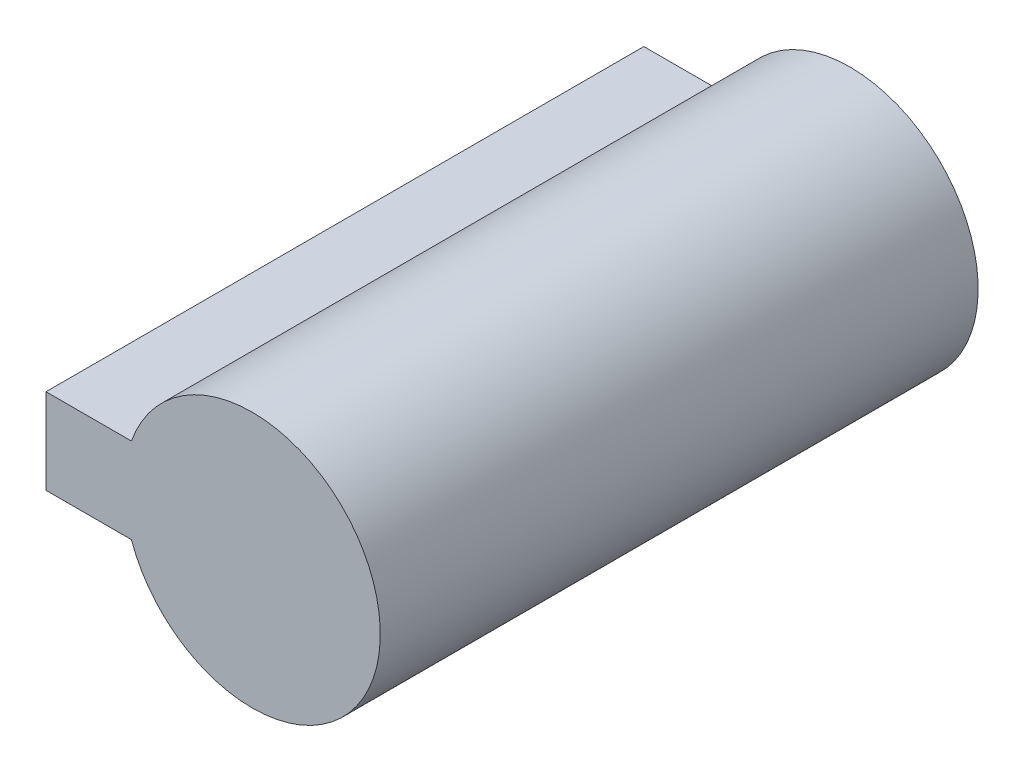
ISO-10303-21;
HEADER;
FILE_DESCRIPTION(('STEP AP214'),'2;1');
FILE_NAME('part.step','',(''),(''),'','','');
FILE_SCHEMA(('AUTOMOTIVE_DESIGN { 1 0 10303 214 1 1 1 1 }'));
ENDSEC;
DATA;
#1=APPLICATION_CONTEXT('core data for automotive mechanical design processes');
#2=APPLICATION_PROTOCOL_DEFINITION('international standard','automotive_design',2000,#1);
#3=PRODUCT_CONTEXT('',#1,'mechanical');
#4=PRODUCT('Part','Part','',(#3));
#5=PRODUCT_RELATED_PRODUCT_CATEGORY('part','',(#4));
#6=PRODUCT_DEFINITION_FORMATION('','',#4);
#7=PRODUCT_DEFINITION_CONTEXT('part definition',#1,'design');
#8=PRODUCT_DEFINITION('design','',#6,#7);
#9=PRODUCT_DEFINITION_SHAPE('','',#8);
#10=(LENGTH_UNIT() NAMED_UNIT(*) SI_UNIT(.MILLI.,.METRE.));
#11=(NAMED_UNIT(*) PLANE_ANGLE_UNIT() SI_UNIT($,.RADIAN.));
#12=(NAMED_UNIT(*) SI_UNIT($,.STERADIAN.) SOLID_ANGLE_UNIT());
#13=UNCERTAINTY_MEASURE_WITH_UNIT(LENGTH_MEASURE(1.E-05),#10,'distance_accuracy_value','');
#14=(GEOMETRIC_REPRESENTATION_CONTEXT(3) GLOBAL_UNCERTAINTY_ASSIGNED_CONTEXT((#13)) GLOBAL_UNIT_ASSIGNED_CONTEXT((#10,
#11,#12)) REPRESENTATION_CONTEXT('',''));
#15=CARTESIAN_POINT('',(0.,0.,0.));
#16=DIRECTION('',(0.,0.,1.));
#17=DIRECTION('',(1.,0.,0.));
#18=AXIS2_PLACEMENT_3D('',#15,#16,#17);
#19=CARTESIAN_POINT('',(0.,0.,70.));
#20=DIRECTION('',(0.,0.,-1.));
#21=DIRECTION('',(-1.,0.,0.));
#22=AXIS2_PLACEMENT_3D('',#19,#20,#21);
#23=CYLINDRICAL_SURFACE('',#22,15.);
#24=CARTESIAN_POINT('',(0.,0.,0.));
#25=DIRECTION('',(0.,0.,1.));
#26=DIRECTION('',(1.,0.,0.));
#27=AXIS2_PLACEMENT_3D('',#24,#25,#26);
#28=CIRCLE('',#27,15.);
#29=CARTESIAN_POINT('',(-14.142135623731,-5.,0.));
#30=VERTEX_POINT('',#29);
#31=CARTESIAN_POINT('',(-14.142135623731,5.,0.));
#32=VERTEX_POINT('',#31);
#33=EDGE_CURVE('E95',#30,#32,#28,.T.);
#34=ORIENTED_EDGE('',*,*,#33,.T.);
#35=DIRECTION('',(0.,0.,-1.));
#36=VECTOR('',#35,1.);
#37=CARTESIAN_POINT('',(-14.142135623731,5.,70.));
#38=LINE('',#37,#36);
#39=CARTESIAN_POINT('',(-14.142135623731,5.,70.));
#40=VERTEX_POINT('',#39);
#41=EDGE_CURVE('E11',#40,#32,#38,.T.);
#42=ORIENTED_EDGE('',*,*,#41,.F.);
#43=CARTESIAN_POINT('',(0.,0.,70.));
#44=DIRECTION('',(0.,0.,1.));
#45=DIRECTION('',(1.,0.,0.));
#46=AXIS2_PLACEMENT_3D('',#43,#44,#45);
#47=CIRCLE('',#46,15.);
#48=CARTESIAN_POINT('',(-14.142135623731,-5.,70.));
#49=VERTEX_POINT('',#48);
#50=EDGE_CURVE('E83',#49,#40,#47,.T.);
#51=ORIENTED_EDGE('',*,*,#50,.F.);
#52=DIRECTION('',(0.,0.,-1.));
#53=VECTOR('',#52,1.);
#54=CARTESIAN_POINT('',(-14.142135623731,-5.,70.));
#55=LINE('',#54,#53);
#56=EDGE_CURVE('E91',#49,#30,#55,.T.);
#57=ORIENTED_EDGE('',*,*,#56,.T.);
#58=EDGE_LOOP('',(#34,#42,#51,#57));
#59=FACE_BOUND('',#58,.T.);
#60=ADVANCED_FACE('F32',(#59),#23,.T.);
#61=CARTESIAN_POINT('',(-14.142135623731,5.,70.));
#62=DIRECTION('',(0.,-1.,0.));
#63=DIRECTION('',(1.,0.,0.));
#64=AXIS2_PLACEMENT_3D('',#61,#62,#63);
#65=PLANE('',#64);
#66=DIRECTION('',(-1.,0.,0.));
#67=VECTOR('',#66,1.);
#68=CARTESIAN_POINT('',(-14.142135623731,5.,0.));
#69=LINE('',#68,#67);
#70=CARTESIAN_POINT('',(-24.142135623731,5.,0.));
#71=VERTEX_POINT('',#70);
#72=EDGE_CURVE('E87',#32,#71,#69,.T.);
#73=ORIENTED_EDGE('',*,*,#72,.T.);
#74=DIRECTION('',(0.,0.,-1.));
#75=VECTOR('',#74,1.);
#76=CARTESIAN_POINT('',(-24.142135623731,5.,70.));
#77=LINE('',#76,#75);
#78=CARTESIAN_POINT('',(-24.142135623731,5.,70.));
#79=VERTEX_POINT('',#78);
#80=EDGE_CURVE('E40',#79,#71,#77,.T.);
#81=ORIENTED_EDGE('',*,*,#80,.F.);
#82=DIRECTION('',(-1.,0.,0.));
#83=VECTOR('',#82,1.);
#84=CARTESIAN_POINT('',(-14.142135623731,5.,70.));
#85=LINE('',#84,#83);
#86=EDGE_CURVE('E78',#40,#79,#85,.T.);
#87=ORIENTED_EDGE('',*,*,#86,.F.);
#88=ORIENTED_EDGE('',*,*,#41,.T.);
#89=EDGE_LOOP('',(#73,#81,#87,#88));
#90=FACE_BOUND('',#89,.T.);
#91=ADVANCED_FACE('F86',(#90),#65,.F.);
#92=CARTESIAN_POINT('',(-24.142135623731,5.,70.));
#93=DIRECTION('',(1.,0.,0.));
#94=DIRECTION('',(0.,0.,-1.));
#95=AXIS2_PLACEMENT_3D('',#92,#93,#94);
#96=PLANE('',#95);
#97=DIRECTION('',(0.,-1.,0.));
#98=VECTOR('',#97,1.);
#99=CARTESIAN_POINT('',(-24.142135623731,5.,0.));
#100=LINE('',#99,#98);
#101=CARTESIAN_POINT('',(-24.142135623731,-5.,0.));
#102=VERTEX_POINT('',#101);
#103=EDGE_CURVE('E65',#71,#102,#100,.T.);
#104=ORIENTED_EDGE('',*,*,#103,.T.);
#105=DIRECTION('',(0.,0.,-1.));
#106=VECTOR('',#105,1.);
#107=CARTESIAN_POINT('',(-24.142135623731,-5.,70.));
#108=LINE('',#107,#106);
#109=CARTESIAN_POINT('',(-24.142135623731,-5.,70.));
#110=VERTEX_POINT('',#109);
#111=EDGE_CURVE('E88',#110,#102,#108,.T.);
#112=ORIENTED_EDGE('',*,*,#111,.F.);
#113=DIRECTION('',(0.,-1.,0.));
#114=VECTOR('',#113,1.);
#115=CARTESIAN_POINT('',(-24.142135623731,5.,70.));
#116=LINE('',#115,#114);
#117=EDGE_CURVE('E81',#79,#110,#116,.T.);
#118=ORIENTED_EDGE('',*,*,#117,.F.);
#119=ORIENTED_EDGE('',*,*,#80,.T.);
#120=EDGE_LOOP('',(#104,#112,#118,#119));
#121=FACE_BOUND('',#120,.T.);
#122=ADVANCED_FACE('F89',(#121),#96,.F.);
#123=CARTESIAN_POINT('',(-24.142135623731,-5.,70.));
#124=DIRECTION('',(0.,1.,0.));
#125=DIRECTION('',(-1.,0.,0.));
#126=AXIS2_PLACEMENT_3D('',#123,#124,#125);
#127=PLANE('',#126);
#128=DIRECTION('',(1.,0.,0.));
#129=VECTOR('',#128,1.);
#130=CARTESIAN_POINT('',(-24.142135623731,-5.,0.));
#131=LINE('',#130,#129);
#132=EDGE_CURVE('E71',#102,#30,#131,.T.);
#133=ORIENTED_EDGE('',*,*,#132,.T.);
#134=ORIENTED_EDGE('',*,*,#56,.F.);
#135=DIRECTION('',(1.,0.,0.));
#136=VECTOR('',#135,1.);
#137=CARTESIAN_POINT('',(-24.142135623731,-5.,70.));
#138=LINE('',#137,#136);
#139=EDGE_CURVE('E48',#110,#49,#138,.T.);
#140=ORIENTED_EDGE('',*,*,#139,.F.);
#141=ORIENTED_EDGE('',*,*,#111,.T.);
#142=EDGE_LOOP('',(#133,#134,#140,#141));
#143=FACE_BOUND('',#142,.T.);
#144=ADVANCED_FACE('F102',(#143),#127,.F.);
#145=CARTESIAN_POINT('',(0.,0.,70.));
#146=DIRECTION('',(0.,0.,1.));
#147=DIRECTION('',(1.,0.,0.));
#148=AXIS2_PLACEMENT_3D('',#145,#146,#147);
#149=PLANE('',#148);
#150=ORIENTED_EDGE('',*,*,#50,.T.);
#151=ORIENTED_EDGE('',*,*,#86,.T.);
#152=ORIENTED_EDGE('',*,*,#117,.T.);
#153=ORIENTED_EDGE('',*,*,#139,.T.);
#154=EDGE_LOOP('',(#150,#151,#152,#153));
#155=FACE_BOUND('',#154,.T.);
#156=ADVANCED_FACE('F79',(#155),#149,.T.);
#157=CARTESIAN_POINT('',(0.,0.,0.));
#158=DIRECTION('',(0.,0.,1.));
#159=DIRECTION('',(1.,0.,0.));
#160=AXIS2_PLACEMENT_3D('',#157,#158,#159);
#161=PLANE('',#160);
#162=ORIENTED_EDGE('',*,*,#33,.F.);
#163=ORIENTED_EDGE('',*,*,#132,.F.);
#164=ORIENTED_EDGE('',*,*,#103,.F.);
#165=ORIENTED_EDGE('',*,*,#72,.F.);
#166=EDGE_LOOP('',(#162,#163,#164,#165));
#167=FACE_BOUND('',#166,.T.);
#168=ADVANCED_FACE('F105',(#167),#161,.F.);
#169=CLOSED_SHELL('',(#60,#91,#122,#144,#156,#168));
#170=MANIFOLD_SOLID_BREP('B2',#169);
#171=ADVANCED_BREP_SHAPE_REPRESENTATION('',(#18,#170),#14);
#172=SHAPE_DEFINITION_REPRESENTATION(#9,#171);
ENDSEC;
END-ISO-10303-21;
